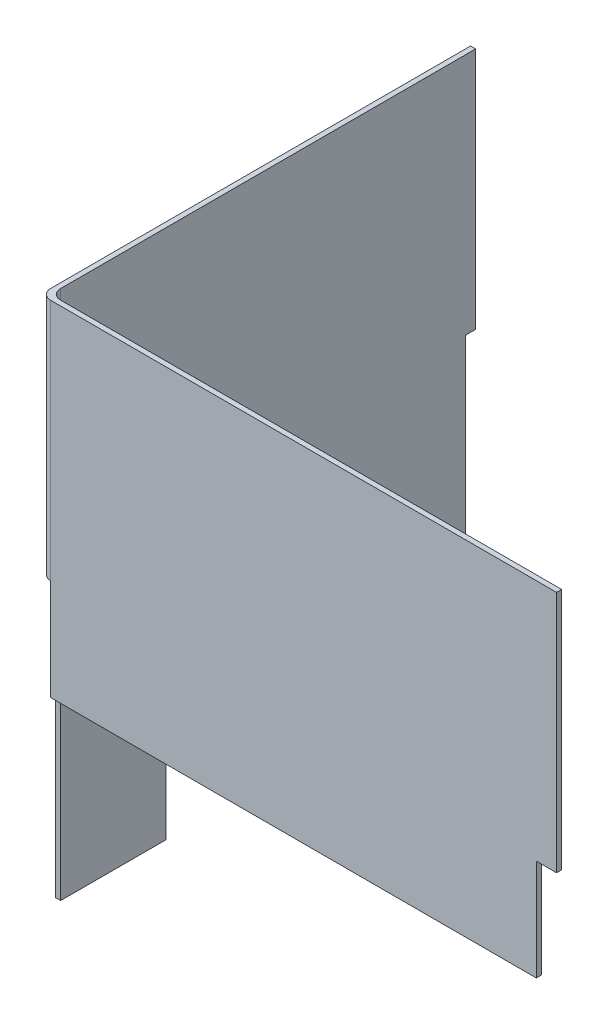
ISO-10303-21;
HEADER;
FILE_DESCRIPTION(('STEP AP214'),'2;1');
FILE_NAME('part.step','',(''),(''),'','','');
FILE_SCHEMA(('AUTOMOTIVE_DESIGN { 1 0 10303 214 1 1 1 1 }'));
ENDSEC;
DATA;
#1=APPLICATION_CONTEXT('core data for automotive mechanical design processes');
#2=APPLICATION_PROTOCOL_DEFINITION('international standard','automotive_design',2000,#1);
#3=PRODUCT_CONTEXT('',#1,'mechanical');
#4=PRODUCT('Part','Part','',(#3));
#5=PRODUCT_RELATED_PRODUCT_CATEGORY('part','',(#4));
#6=PRODUCT_DEFINITION_FORMATION('','',#4);
#7=PRODUCT_DEFINITION_CONTEXT('part definition',#1,'design');
#8=PRODUCT_DEFINITION('design','',#6,#7);
#9=PRODUCT_DEFINITION_SHAPE('','',#8);
#10=(LENGTH_UNIT() NAMED_UNIT(*) SI_UNIT(.MILLI.,.METRE.));
#11=(NAMED_UNIT(*) PLANE_ANGLE_UNIT() SI_UNIT($,.RADIAN.));
#12=(NAMED_UNIT(*) SI_UNIT($,.STERADIAN.) SOLID_ANGLE_UNIT());
#13=UNCERTAINTY_MEASURE_WITH_UNIT(LENGTH_MEASURE(1.E-05),#10,'distance_accuracy_value','');
#14=(GEOMETRIC_REPRESENTATION_CONTEXT(3) GLOBAL_UNCERTAINTY_ASSIGNED_CONTEXT((#13)) GLOBAL_UNIT_ASSIGNED_CONTEXT((#10,
#11,#12)) REPRESENTATION_CONTEXT('',''));
#15=CARTESIAN_POINT('',(0.,0.,0.));
#16=DIRECTION('',(0.,0.,1.));
#17=DIRECTION('',(1.,0.,0.));
#18=AXIS2_PLACEMENT_3D('',#15,#16,#17);
#19=CARTESIAN_POINT('',(-152.399999999999,0.,123.825));
#20=DIRECTION('',(0.,1.,0.));
#21=DIRECTION('',(0.,0.,1.));
#22=AXIS2_PLACEMENT_3D('',#19,#20,#21);
#23=PLANE('',#22);
#24=DIRECTION('',(0.,0.,-1.));
#25=VECTOR('',#24,1.);
#26=CARTESIAN_POINT('',(-155.575,0.,-139.7));
#27=LINE('',#26,#25);
#28=CARTESIAN_POINT('',(-155.575,0.,-133.349999999999));
#29=VERTEX_POINT('',#28);
#30=CARTESIAN_POINT('',(-155.575,0.,-139.7));
#31=VERTEX_POINT('',#30);
#32=EDGE_CURVE('E148',#29,#31,#27,.T.);
#33=ORIENTED_EDGE('',*,*,#32,.F.);
#34=DIRECTION('',(-1.,0.,0.));
#35=VECTOR('',#34,1.);
#36=CARTESIAN_POINT('',(-155.575,0.,-133.349999999999));
#37=LINE('',#36,#35);
#38=CARTESIAN_POINT('',(-158.75,0.,-133.349999999999));
#39=VERTEX_POINT('',#38);
#40=EDGE_CURVE('E222',#29,#39,#37,.T.);
#41=ORIENTED_EDGE('',*,*,#40,.T.);
#42=DIRECTION('',(0.,0.,1.));
#43=VECTOR('',#42,1.);
#44=CARTESIAN_POINT('',(-158.75,0.,-139.7));
#45=LINE('',#44,#43);
#46=CARTESIAN_POINT('',(-158.75,0.,-139.7));
#47=VERTEX_POINT('',#46);
#48=EDGE_CURVE('E152',#47,#39,#45,.T.);
#49=ORIENTED_EDGE('',*,*,#48,.F.);
#50=DIRECTION('',(-1.,0.,0.));
#51=VECTOR('',#50,1.);
#52=CARTESIAN_POINT('',(-158.75,0.,-139.7));
#53=LINE('',#52,#51);
#54=EDGE_CURVE('E150',#31,#47,#53,.T.);
#55=ORIENTED_EDGE('',*,*,#54,.F.);
#56=EDGE_LOOP('',(#33,#41,#49,#55));
#57=FACE_BOUND('',#56,.T.);
#58=ADVANCED_FACE('F33',(#57),#23,.F.);
#59=DIRECTION('',(0.,0.,1.));
#60=VECTOR('',#59,1.);
#61=CARTESIAN_POINT('',(152.399999999993,0.,127.));
#62=LINE('',#61,#60);
#63=CARTESIAN_POINT('',(152.399999999993,0.,127.));
#64=VERTEX_POINT('',#63);
#65=CARTESIAN_POINT('',(152.399999999993,0.,130.175));
#66=VERTEX_POINT('',#65);
#67=EDGE_CURVE('E183',#64,#66,#62,.T.);
#68=ORIENTED_EDGE('',*,*,#67,.F.);
#69=DIRECTION('',(-1.,0.,0.));
#70=VECTOR('',#69,1.);
#71=CARTESIAN_POINT('',(-149.224999999999,0.,127.));
#72=LINE('',#71,#70);
#73=CARTESIAN_POINT('',(165.099999999993,0.,127.));
#74=VERTEX_POINT('',#73);
#75=EDGE_CURVE('E141',#74,#64,#72,.T.);
#76=ORIENTED_EDGE('',*,*,#75,.F.);
#77=DIRECTION('',(0.,0.,-1.));
#78=VECTOR('',#77,1.);
#79=CARTESIAN_POINT('',(165.099999999993,0.,127.));
#80=LINE('',#79,#78);
#81=CARTESIAN_POINT('',(165.099999999993,0.,130.175));
#82=VERTEX_POINT('',#81);
#83=EDGE_CURVE('E138',#82,#74,#80,.T.);
#84=ORIENTED_EDGE('',*,*,#83,.F.);
#85=DIRECTION('',(1.,0.,0.));
#86=VECTOR('',#85,1.);
#87=CARTESIAN_POINT('',(-152.399999999999,0.,130.175));
#88=LINE('',#87,#86);
#89=EDGE_CURVE('E84',#66,#82,#88,.T.);
#90=ORIENTED_EDGE('',*,*,#89,.F.);
#91=EDGE_LOOP('',(#68,#76,#84,#90));
#92=FACE_BOUND('',#91,.T.);
#93=ADVANCED_FACE('F180',(#92),#23,.F.);
#94=CARTESIAN_POINT('',(165.099999999993,152.4,127.));
#95=DIRECTION('',(-1.,0.,0.));
#96=DIRECTION('',(0.,0.,1.));
#97=AXIS2_PLACEMENT_3D('',#94,#95,#96);
#98=PLANE('',#97);
#99=ORIENTED_EDGE('',*,*,#83,.T.);
#100=DIRECTION('',(0.,-1.,0.));
#101=VECTOR('',#100,1.);
#102=CARTESIAN_POINT('',(165.099999999993,152.4,127.));
#103=LINE('',#102,#101);
#104=CARTESIAN_POINT('',(165.099999999993,152.4,127.));
#105=VERTEX_POINT('',#104);
#106=EDGE_CURVE('E37',#105,#74,#103,.T.);
#107=ORIENTED_EDGE('',*,*,#106,.F.);
#108=DIRECTION('',(0.,0.,-1.));
#109=VECTOR('',#108,1.);
#110=CARTESIAN_POINT('',(165.099999999993,152.4,127.));
#111=LINE('',#110,#109);
#112=CARTESIAN_POINT('',(165.099999999993,152.4,130.175));
#113=VERTEX_POINT('',#112);
#114=EDGE_CURVE('E157',#113,#105,#111,.T.);
#115=ORIENTED_EDGE('',*,*,#114,.F.);
#116=DIRECTION('',(0.,-1.,0.));
#117=VECTOR('',#116,1.);
#118=CARTESIAN_POINT('',(165.099999999993,152.4,130.175));
#119=LINE('',#118,#117);
#120=EDGE_CURVE('E134',#113,#82,#119,.T.);
#121=ORIENTED_EDGE('',*,*,#120,.T.);
#122=EDGE_LOOP('',(#99,#107,#115,#121));
#123=FACE_BOUND('',#122,.T.);
#124=ADVANCED_FACE('F35',(#123),#98,.F.);
#125=CARTESIAN_POINT('',(-149.224999999999,152.4,127.));
#126=DIRECTION('',(0.,0.,1.));
#127=DIRECTION('',(1.,0.,0.));
#128=AXIS2_PLACEMENT_3D('',#125,#126,#127);
#129=PLANE('',#128);
#130=ORIENTED_EDGE('',*,*,#75,.T.);
#131=DIRECTION('',(0.,1.,0.));
#132=VECTOR('',#131,1.);
#133=CARTESIAN_POINT('',(152.399999999993,-63.5,127.));
#134=LINE('',#133,#132);
#135=CARTESIAN_POINT('',(152.399999999993,-63.5,127.));
#136=VERTEX_POINT('',#135);
#137=EDGE_CURVE('E249',#136,#64,#134,.T.);
#138=ORIENTED_EDGE('',*,*,#137,.F.);
#139=DIRECTION('',(1.,0.,0.));
#140=VECTOR('',#139,1.);
#141=CARTESIAN_POINT('',(-152.400000000007,-63.5,127.));
#142=LINE('',#141,#140);
#143=CARTESIAN_POINT('',(-152.400000000007,-63.5,127.));
#144=VERTEX_POINT('',#143);
#145=EDGE_CURVE('E191',#144,#136,#142,.T.);
#146=ORIENTED_EDGE('',*,*,#145,.F.);
#147=DIRECTION('',(0.,-1.,0.));
#148=VECTOR('',#147,1.);
#149=CARTESIAN_POINT('',(-152.400000000007,-63.5,127.));
#150=LINE('',#149,#148);
#151=CARTESIAN_POINT('',(-152.400000000007,0.,127.));
#152=VERTEX_POINT('',#151);
#153=EDGE_CURVE('E197',#152,#144,#150,.T.);
#154=ORIENTED_EDGE('',*,*,#153,.F.);
#155=DIRECTION('',(-1.,0.,0.));
#156=VECTOR('',#155,1.);
#157=CARTESIAN_POINT('',(-152.400000000007,0.,127.));
#158=LINE('',#157,#156);
#159=CARTESIAN_POINT('',(-149.224999999999,0.,127.));
#160=VERTEX_POINT('',#159);
#161=EDGE_CURVE('E11',#160,#152,#158,.T.);
#162=ORIENTED_EDGE('',*,*,#161,.F.);
#163=DIRECTION('',(0.,-1.,0.));
#164=VECTOR('',#163,1.);
#165=CARTESIAN_POINT('',(-149.224999999999,152.4,127.));
#166=LINE('',#165,#164);
#167=CARTESIAN_POINT('',(-149.224999999999,152.4,127.));
#168=VERTEX_POINT('',#167);
#169=EDGE_CURVE('E166',#168,#160,#166,.T.);
#170=ORIENTED_EDGE('',*,*,#169,.F.);
#171=DIRECTION('',(-1.,0.,0.));
#172=VECTOR('',#171,1.);
#173=CARTESIAN_POINT('',(-149.224999999999,152.4,127.));
#174=LINE('',#173,#172);
#175=EDGE_CURVE('E93',#105,#168,#174,.T.);
#176=ORIENTED_EDGE('',*,*,#175,.F.);
#177=ORIENTED_EDGE('',*,*,#106,.T.);
#178=EDGE_LOOP('',(#130,#138,#146,#154,#162,#170,#176,#177));
#179=FACE_BOUND('',#178,.T.);
#180=ADVANCED_FACE('F172',(#179),#129,.F.);
#181=CARTESIAN_POINT('',(-149.224999999999,152.4,120.65));
#182=DIRECTION('',(0.,-1.,0.));
#183=DIRECTION('',(0.,0.,-1.));
#184=AXIS2_PLACEMENT_3D('',#181,#182,#183);
#185=CYLINDRICAL_SURFACE('',#184,6.35000000000001);
#186=CARTESIAN_POINT('',(-149.224999999999,0.,120.65));
#187=DIRECTION('',(0.,-1.,0.));
#188=DIRECTION('',(0.,0.,-1.));
#189=AXIS2_PLACEMENT_3D('',#186,#187,#188);
#190=CIRCLE('',#189,6.35000000000001);
#191=CARTESIAN_POINT('',(-155.574999999999,0.,120.650000000001));
#192=VERTEX_POINT('',#191);
#193=EDGE_CURVE('E145',#160,#192,#190,.T.);
#194=ORIENTED_EDGE('',*,*,#193,.T.);
#195=DIRECTION('',(0.,-1.,0.));
#196=VECTOR('',#195,1.);
#197=CARTESIAN_POINT('',(-155.574999999999,152.4,120.65));
#198=LINE('',#197,#196);
#199=CARTESIAN_POINT('',(-155.574999999999,152.4,120.65));
#200=VERTEX_POINT('',#199);
#201=EDGE_CURVE('E164',#200,#192,#198,.T.);
#202=ORIENTED_EDGE('',*,*,#201,.F.);
#203=CARTESIAN_POINT('',(-149.224999999999,152.4,120.65));
#204=DIRECTION('',(0.,-1.,0.));
#205=DIRECTION('',(0.,0.,-1.));
#206=AXIS2_PLACEMENT_3D('',#203,#204,#205);
#207=CIRCLE('',#206,6.35000000000001);
#208=EDGE_CURVE('E203',#168,#200,#207,.T.);
#209=ORIENTED_EDGE('',*,*,#208,.F.);
#210=ORIENTED_EDGE('',*,*,#169,.T.);
#211=EDGE_LOOP('',(#194,#202,#209,#210));
#212=FACE_BOUND('',#211,.T.);
#213=ADVANCED_FACE('F381',(#212),#185,.F.);
#214=CARTESIAN_POINT('',(-155.575,152.4,-139.7));
#215=DIRECTION('',(-1.,0.,0.));
#216=DIRECTION('',(0.,0.,1.));
#217=AXIS2_PLACEMENT_3D('',#214,#215,#216);
#218=PLANE('',#217);
#219=ORIENTED_EDGE('',*,*,#201,.T.);
#220=DIRECTION('',(0.,1.,0.));
#221=VECTOR('',#220,1.);
#222=CARTESIAN_POINT('',(-155.574999999999,0.,120.650000000001));
#223=LINE('',#222,#221);
#224=CARTESIAN_POINT('',(-155.574999999999,-180.1876,120.650000000001));
#225=VERTEX_POINT('',#224);
#226=EDGE_CURVE('E347',#225,#192,#223,.T.);
#227=ORIENTED_EDGE('',*,*,#226,.F.);
#228=DIRECTION('',(0.,0.,1.));
#229=VECTOR('',#228,1.);
#230=CARTESIAN_POINT('',(-155.574999999999,-180.1876,120.650000000001));
#231=LINE('',#230,#229);
#232=CARTESIAN_POINT('',(-155.574999999999,-180.1876,54.6100000000006));
#233=VERTEX_POINT('',#232);
#234=EDGE_CURVE('E337',#233,#225,#231,.T.);
#235=ORIENTED_EDGE('',*,*,#234,.F.);
#236=DIRECTION('',(0.,-1.,0.));
#237=VECTOR('',#236,1.);
#238=CARTESIAN_POINT('',(-155.574999999999,-139.7,54.6100000000006));
#239=LINE('',#238,#237);
#240=CARTESIAN_POINT('',(-155.574999999999,-139.7,54.6100000000006));
#241=VERTEX_POINT('',#240);
#242=EDGE_CURVE('E323',#241,#233,#239,.T.);
#243=ORIENTED_EDGE('',*,*,#242,.F.);
#244=CARTESIAN_POINT('',(-155.575,-139.7,-6.34999999999943));
#245=DIRECTION('',(1.,0.,0.));
#246=DIRECTION('',(0.,0.,1.));
#247=AXIS2_PLACEMENT_3D('',#244,#245,#246);
#248=CIRCLE('',#247,60.96);
#249=CARTESIAN_POINT('',(-155.575,-139.7,-67.3099999999994));
#250=VERTEX_POINT('',#249);
#251=EDGE_CURVE('E333',#250,#241,#248,.T.);
#252=ORIENTED_EDGE('',*,*,#251,.F.);
#253=DIRECTION('',(0.,1.,0.));
#254=VECTOR('',#253,1.);
#255=CARTESIAN_POINT('',(-155.575,-139.7,-67.3099999999994));
#256=LINE('',#255,#254);
#257=CARTESIAN_POINT('',(-155.575,-180.1876,-67.3099999999994));
#258=VERTEX_POINT('',#257);
#259=EDGE_CURVE('E248',#258,#250,#256,.T.);
#260=ORIENTED_EDGE('',*,*,#259,.F.);
#261=DIRECTION('',(0.,0.,1.));
#262=VECTOR('',#261,1.);
#263=CARTESIAN_POINT('',(-155.575,-180.1876,-67.3099999999994));
#264=LINE('',#263,#262);
#265=CARTESIAN_POINT('',(-155.575,-180.1876,-133.349999999998));
#266=VERTEX_POINT('',#265);
#267=EDGE_CURVE('E351',#266,#258,#264,.T.);
#268=ORIENTED_EDGE('',*,*,#267,.F.);
#269=DIRECTION('',(0.,-1.,0.));
#270=VECTOR('',#269,1.);
#271=CARTESIAN_POINT('',(-155.575,-180.1876,-133.349999999998));
#272=LINE('',#271,#270);
#273=EDGE_CURVE('E349',#29,#266,#272,.T.);
#274=ORIENTED_EDGE('',*,*,#273,.F.);
#275=ORIENTED_EDGE('',*,*,#32,.T.);
#276=DIRECTION('',(0.,-1.,0.));
#277=VECTOR('',#276,1.);
#278=CARTESIAN_POINT('',(-155.575,152.4,-139.7));
#279=LINE('',#278,#277);
#280=CARTESIAN_POINT('',(-155.575,152.4,-139.7));
#281=VERTEX_POINT('',#280);
#282=EDGE_CURVE('E161',#281,#31,#279,.T.);
#283=ORIENTED_EDGE('',*,*,#282,.F.);
#284=DIRECTION('',(0.,0.,-1.));
#285=VECTOR('',#284,1.);
#286=CARTESIAN_POINT('',(-155.575,152.4,-139.7));
#287=LINE('',#286,#285);
#288=EDGE_CURVE('E205',#200,#281,#287,.T.);
#289=ORIENTED_EDGE('',*,*,#288,.F.);
#290=EDGE_LOOP('',(#219,#227,#235,#243,#252,#260,#268,#274,#275,#283,#289));
#291=FACE_BOUND('',#290,.T.);
#292=ADVANCED_FACE('F210',(#291),#218,.F.);
#293=CARTESIAN_POINT('',(-158.75,152.4,-139.7));
#294=DIRECTION('',(0.,0.,1.));
#295=DIRECTION('',(1.,0.,0.));
#296=AXIS2_PLACEMENT_3D('',#293,#294,#295);
#297=PLANE('',#296);
#298=ORIENTED_EDGE('',*,*,#54,.T.);
#299=DIRECTION('',(0.,-1.,0.));
#300=VECTOR('',#299,1.);
#301=CARTESIAN_POINT('',(-158.75,152.4,-139.7));
#302=LINE('',#301,#300);
#303=CARTESIAN_POINT('',(-158.75,152.4,-139.7));
#304=VERTEX_POINT('',#303);
#305=EDGE_CURVE('E128',#304,#47,#302,.T.);
#306=ORIENTED_EDGE('',*,*,#305,.F.);
#307=DIRECTION('',(-1.,0.,0.));
#308=VECTOR('',#307,1.);
#309=CARTESIAN_POINT('',(-158.75,152.4,-139.7));
#310=LINE('',#309,#308);
#311=EDGE_CURVE('E115',#281,#304,#310,.T.);
#312=ORIENTED_EDGE('',*,*,#311,.F.);
#313=ORIENTED_EDGE('',*,*,#282,.T.);
#314=EDGE_LOOP('',(#298,#306,#312,#313));
#315=FACE_BOUND('',#314,.T.);
#316=ADVANCED_FACE('F215',(#315),#297,.F.);
#317=CARTESIAN_POINT('',(-158.75,152.4,-139.7));
#318=DIRECTION('',(1.,0.,0.));
#319=DIRECTION('',(0.,0.,-1.));
#320=AXIS2_PLACEMENT_3D('',#317,#318,#319);
#321=PLANE('',#320);
#322=ORIENTED_EDGE('',*,*,#48,.T.);
#323=DIRECTION('',(0.,-1.,0.));
#324=VECTOR('',#323,1.);
#325=CARTESIAN_POINT('',(-158.75,-180.1876,-133.349999999998));
#326=LINE('',#325,#324);
#327=CARTESIAN_POINT('',(-158.75,-180.1876,-133.349999999998));
#328=VERTEX_POINT('',#327);
#329=EDGE_CURVE('E361',#39,#328,#326,.T.);
#330=ORIENTED_EDGE('',*,*,#329,.T.);
#331=DIRECTION('',(0.,0.,1.));
#332=VECTOR('',#331,1.);
#333=CARTESIAN_POINT('',(-158.75,-180.1876,-67.3099999999994));
#334=LINE('',#333,#332);
#335=CARTESIAN_POINT('',(-158.75,-180.1876,-67.3099999999994));
#336=VERTEX_POINT('',#335);
#337=EDGE_CURVE('E343',#328,#336,#334,.T.);
#338=ORIENTED_EDGE('',*,*,#337,.T.);
#339=DIRECTION('',(0.,1.,0.));
#340=VECTOR('',#339,1.);
#341=CARTESIAN_POINT('',(-158.75,-139.7,-67.3099999999994));
#342=LINE('',#341,#340);
#343=CARTESIAN_POINT('',(-158.75,-139.7,-67.3099999999994));
#344=VERTEX_POINT('',#343);
#345=EDGE_CURVE('E340',#336,#344,#342,.T.);
#346=ORIENTED_EDGE('',*,*,#345,.T.);
#347=CARTESIAN_POINT('',(-158.75,-139.7,-6.34999999999942));
#348=DIRECTION('',(1.,0.,0.));
#349=DIRECTION('',(0.,0.,1.));
#350=AXIS2_PLACEMENT_3D('',#347,#348,#349);
#351=CIRCLE('',#350,60.96);
#352=CARTESIAN_POINT('',(-158.749999999999,-139.7,54.6100000000006));
#353=VERTEX_POINT('',#352);
#354=EDGE_CURVE('E355',#344,#353,#351,.T.);
#355=ORIENTED_EDGE('',*,*,#354,.T.);
#356=DIRECTION('',(0.,-1.,0.));
#357=VECTOR('',#356,1.);
#358=CARTESIAN_POINT('',(-158.749999999999,-139.7,54.6100000000006));
#359=LINE('',#358,#357);
#360=CARTESIAN_POINT('',(-158.749999999999,-180.1876,54.6100000000006));
#361=VERTEX_POINT('',#360);
#362=EDGE_CURVE('E325',#353,#361,#359,.T.);
#363=ORIENTED_EDGE('',*,*,#362,.T.);
#364=DIRECTION('',(0.,0.,1.));
#365=VECTOR('',#364,1.);
#366=CARTESIAN_POINT('',(-158.749999999999,-180.1876,120.650000000001));
#367=LINE('',#366,#365);
#368=CARTESIAN_POINT('',(-158.749999999999,-180.1876,120.650000000001));
#369=VERTEX_POINT('',#368);
#370=EDGE_CURVE('E358',#361,#369,#367,.T.);
#371=ORIENTED_EDGE('',*,*,#370,.T.);
#372=DIRECTION('',(0.,1.,0.));
#373=VECTOR('',#372,1.);
#374=CARTESIAN_POINT('',(-158.749999999999,0.,120.650000000001));
#375=LINE('',#374,#373);
#376=CARTESIAN_POINT('',(-158.749999999999,0.,120.650000000001));
#377=VERTEX_POINT('',#376);
#378=EDGE_CURVE('E49',#369,#377,#375,.T.);
#379=ORIENTED_EDGE('',*,*,#378,.T.);
#380=CARTESIAN_POINT('',(-158.749999999999,0.,123.825));
#381=VERTEX_POINT('',#380);
#382=EDGE_CURVE('E124',#377,#381,#45,.T.);
#383=ORIENTED_EDGE('',*,*,#382,.T.);
#384=DIRECTION('',(0.,-1.,0.));
#385=VECTOR('',#384,1.);
#386=CARTESIAN_POINT('',(-158.749999999999,152.4,123.825));
#387=LINE('',#386,#385);
#388=CARTESIAN_POINT('',(-158.749999999999,152.4,123.825));
#389=VERTEX_POINT('',#388);
#390=EDGE_CURVE('E120',#389,#381,#387,.T.);
#391=ORIENTED_EDGE('',*,*,#390,.F.);
#392=DIRECTION('',(0.,0.,1.));
#393=VECTOR('',#392,1.);
#394=CARTESIAN_POINT('',(-158.75,152.4,-139.7));
#395=LINE('',#394,#393);
#396=EDGE_CURVE('E108',#304,#389,#395,.T.);
#397=ORIENTED_EDGE('',*,*,#396,.F.);
#398=ORIENTED_EDGE('',*,*,#305,.T.);
#399=EDGE_LOOP('',(#322,#330,#338,#346,#355,#363,#371,#379,#383,#391,#397,#398));
#400=FACE_BOUND('',#399,.T.);
#401=ADVANCED_FACE('F122',(#400),#321,.F.);
#402=CARTESIAN_POINT('',(-152.399999999999,152.4,123.825));
#403=DIRECTION('',(0.,-1.,0.));
#404=DIRECTION('',(0.,0.,-1.));
#405=AXIS2_PLACEMENT_3D('',#402,#403,#404);
#406=CYLINDRICAL_SURFACE('',#405,6.35000000000001);
#407=CARTESIAN_POINT('',(-152.399999999999,0.,123.825));
#408=DIRECTION('',(0.,1.,0.));
#409=DIRECTION('',(0.,0.,1.));
#410=AXIS2_PLACEMENT_3D('',#407,#408,#409);
#411=CIRCLE('',#410,6.35000000000001);
#412=CARTESIAN_POINT('',(-152.399999999999,0.,130.175));
#413=VERTEX_POINT('',#412);
#414=EDGE_CURVE('E154',#381,#413,#411,.T.);
#415=ORIENTED_EDGE('',*,*,#414,.T.);
#416=DIRECTION('',(0.,-1.,0.));
#417=VECTOR('',#416,1.);
#418=CARTESIAN_POINT('',(-152.399999999999,152.4,130.175));
#419=LINE('',#418,#417);
#420=CARTESIAN_POINT('',(-152.399999999999,152.4,130.175));
#421=VERTEX_POINT('',#420);
#422=EDGE_CURVE('E129',#421,#413,#419,.T.);
#423=ORIENTED_EDGE('',*,*,#422,.F.);
#424=CARTESIAN_POINT('',(-152.399999999999,152.4,123.825));
#425=DIRECTION('',(0.,1.,0.));
#426=DIRECTION('',(0.,0.,1.));
#427=AXIS2_PLACEMENT_3D('',#424,#425,#426);
#428=CIRCLE('',#427,6.35000000000001);
#429=EDGE_CURVE('E112',#389,#421,#428,.T.);
#430=ORIENTED_EDGE('',*,*,#429,.F.);
#431=ORIENTED_EDGE('',*,*,#390,.T.);
#432=EDGE_LOOP('',(#415,#423,#430,#431));
#433=FACE_BOUND('',#432,.T.);
#434=ADVANCED_FACE('F131',(#433),#406,.T.);
#435=CARTESIAN_POINT('',(-152.399999999999,152.4,130.175));
#436=DIRECTION('',(0.,0.,-1.));
#437=DIRECTION('',(-1.,0.,0.));
#438=AXIS2_PLACEMENT_3D('',#435,#436,#437);
#439=PLANE('',#438);
#440=ORIENTED_EDGE('',*,*,#422,.T.);
#441=DIRECTION('',(0.,-1.,0.));
#442=VECTOR('',#441,1.);
#443=CARTESIAN_POINT('',(-152.400000000007,-63.5,130.175));
#444=LINE('',#443,#442);
#445=CARTESIAN_POINT('',(-152.400000000007,-63.5,130.175));
#446=VERTEX_POINT('',#445);
#447=EDGE_CURVE('E256',#413,#446,#444,.T.);
#448=ORIENTED_EDGE('',*,*,#447,.T.);
#449=DIRECTION('',(1.,0.,0.));
#450=VECTOR('',#449,1.);
#451=CARTESIAN_POINT('',(-152.400000000007,-63.5,130.175));
#452=LINE('',#451,#450);
#453=CARTESIAN_POINT('',(152.399999999993,-63.5,130.175));
#454=VERTEX_POINT('',#453);
#455=EDGE_CURVE('E250',#446,#454,#452,.T.);
#456=ORIENTED_EDGE('',*,*,#455,.T.);
#457=DIRECTION('',(0.,1.,0.));
#458=VECTOR('',#457,1.);
#459=CARTESIAN_POINT('',(152.399999999993,-63.5,130.175));
#460=LINE('',#459,#458);
#461=EDGE_CURVE('E254',#454,#66,#460,.T.);
#462=ORIENTED_EDGE('',*,*,#461,.T.);
#463=ORIENTED_EDGE('',*,*,#89,.T.);
#464=ORIENTED_EDGE('',*,*,#120,.F.);
#465=DIRECTION('',(1.,0.,0.));
#466=VECTOR('',#465,1.);
#467=CARTESIAN_POINT('',(-152.399999999999,152.4,130.175));
#468=LINE('',#467,#466);
#469=EDGE_CURVE('E58',#421,#113,#468,.T.);
#470=ORIENTED_EDGE('',*,*,#469,.F.);
#471=EDGE_LOOP('',(#440,#448,#456,#462,#463,#464,#470));
#472=FACE_BOUND('',#471,.T.);
#473=ADVANCED_FACE('F275',(#472),#439,.F.);
#474=CARTESIAN_POINT('',(-152.399999999999,152.4,123.825));
#475=DIRECTION('',(0.,1.,0.));
#476=DIRECTION('',(0.,0.,1.));
#477=AXIS2_PLACEMENT_3D('',#474,#475,#476);
#478=PLANE('',#477);
#479=ORIENTED_EDGE('',*,*,#114,.T.);
#480=ORIENTED_EDGE('',*,*,#175,.T.);
#481=ORIENTED_EDGE('',*,*,#208,.T.);
#482=ORIENTED_EDGE('',*,*,#288,.T.);
#483=ORIENTED_EDGE('',*,*,#311,.T.);
#484=ORIENTED_EDGE('',*,*,#396,.T.);
#485=ORIENTED_EDGE('',*,*,#429,.T.);
#486=ORIENTED_EDGE('',*,*,#469,.T.);
#487=EDGE_LOOP('',(#479,#480,#481,#482,#483,#484,#485,#486));
#488=FACE_BOUND('',#487,.T.);
#489=ADVANCED_FACE('F110',(#488),#478,.T.);
#490=ORIENTED_EDGE('',*,*,#382,.F.);
#491=DIRECTION('',(-1.,0.,0.));
#492=VECTOR('',#491,1.);
#493=CARTESIAN_POINT('',(-155.574999999999,0.,120.650000000001));
#494=LINE('',#493,#492);
#495=EDGE_CURVE('E231',#192,#377,#494,.T.);
#496=ORIENTED_EDGE('',*,*,#495,.F.);
#497=ORIENTED_EDGE('',*,*,#193,.F.);
#498=ORIENTED_EDGE('',*,*,#161,.T.);
#499=DIRECTION('',(0.,0.,1.));
#500=VECTOR('',#499,1.);
#501=CARTESIAN_POINT('',(-152.400000000007,0.,127.));
#502=LINE('',#501,#500);
#503=EDGE_CURVE('E190',#152,#413,#502,.T.);
#504=ORIENTED_EDGE('',*,*,#503,.T.);
#505=ORIENTED_EDGE('',*,*,#414,.F.);
#506=EDGE_LOOP('',(#490,#496,#497,#498,#504,#505));
#507=FACE_BOUND('',#506,.T.);
#508=ADVANCED_FACE('F379',(#507),#23,.F.);
#509=CARTESIAN_POINT('',(152.399999999993,-63.5,127.));
#510=DIRECTION('',(1.,0.,0.));
#511=DIRECTION('',(0.,0.,-1.));
#512=AXIS2_PLACEMENT_3D('',#509,#510,#511);
#513=PLANE('',#512);
#514=ORIENTED_EDGE('',*,*,#461,.F.);
#515=DIRECTION('',(0.,0.,1.));
#516=VECTOR('',#515,1.);
#517=CARTESIAN_POINT('',(152.399999999993,-63.5,127.));
#518=LINE('',#517,#516);
#519=EDGE_CURVE('E142',#136,#454,#518,.T.);
#520=ORIENTED_EDGE('',*,*,#519,.F.);
#521=ORIENTED_EDGE('',*,*,#137,.T.);
#522=ORIENTED_EDGE('',*,*,#67,.T.);
#523=EDGE_LOOP('',(#514,#520,#521,#522));
#524=FACE_BOUND('',#523,.T.);
#525=ADVANCED_FACE('F279',(#524),#513,.T.);
#526=CARTESIAN_POINT('',(-152.400000000007,-63.5,127.));
#527=DIRECTION('',(0.,-1.,0.));
#528=DIRECTION('',(0.,0.,-1.));
#529=AXIS2_PLACEMENT_3D('',#526,#527,#528);
#530=PLANE('',#529);
#531=ORIENTED_EDGE('',*,*,#455,.F.);
#532=DIRECTION('',(0.,0.,1.));
#533=VECTOR('',#532,1.);
#534=CARTESIAN_POINT('',(-152.400000000007,-63.5,127.));
#535=LINE('',#534,#533);
#536=EDGE_CURVE('E194',#144,#446,#535,.T.);
#537=ORIENTED_EDGE('',*,*,#536,.F.);
#538=ORIENTED_EDGE('',*,*,#145,.T.);
#539=ORIENTED_EDGE('',*,*,#519,.T.);
#540=EDGE_LOOP('',(#531,#537,#538,#539));
#541=FACE_BOUND('',#540,.T.);
#542=ADVANCED_FACE('F276',(#541),#530,.T.);
#543=CARTESIAN_POINT('',(-152.400000000007,-63.5,127.));
#544=DIRECTION('',(-1.,0.,0.));
#545=DIRECTION('',(0.,0.,1.));
#546=AXIS2_PLACEMENT_3D('',#543,#544,#545);
#547=PLANE('',#546);
#548=ORIENTED_EDGE('',*,*,#447,.F.);
#549=ORIENTED_EDGE('',*,*,#503,.F.);
#550=ORIENTED_EDGE('',*,*,#153,.T.);
#551=ORIENTED_EDGE('',*,*,#536,.T.);
#552=EDGE_LOOP('',(#548,#549,#550,#551));
#553=FACE_BOUND('',#552,.T.);
#554=ADVANCED_FACE('F267',(#553),#547,.T.);
#555=CARTESIAN_POINT('',(-155.575,-139.7,-6.34999999999943));
#556=DIRECTION('',(-1.,0.,0.));
#557=DIRECTION('',(0.,0.,1.));
#558=AXIS2_PLACEMENT_3D('',#555,#556,#557);
#559=CYLINDRICAL_SURFACE('',#558,60.96);
#560=ORIENTED_EDGE('',*,*,#354,.F.);
#561=DIRECTION('',(-1.,0.,0.));
#562=VECTOR('',#561,1.);
#563=CARTESIAN_POINT('',(-155.575,-139.7,-67.3099999999994));
#564=LINE('',#563,#562);
#565=EDGE_CURVE('E257',#250,#344,#564,.T.);
#566=ORIENTED_EDGE('',*,*,#565,.F.);
#567=ORIENTED_EDGE('',*,*,#251,.T.);
#568=DIRECTION('',(-1.,0.,0.));
#569=VECTOR('',#568,1.);
#570=CARTESIAN_POINT('',(-155.574999999999,-139.7,54.6100000000006));
#571=LINE('',#570,#569);
#572=EDGE_CURVE('E245',#241,#353,#571,.T.);
#573=ORIENTED_EDGE('',*,*,#572,.T.);
#574=EDGE_LOOP('',(#560,#566,#567,#573));
#575=FACE_BOUND('',#574,.T.);
#576=ADVANCED_FACE('F339',(#575),#559,.F.);
#577=CARTESIAN_POINT('',(-155.575,-139.7,-67.3099999999994));
#578=DIRECTION('',(0.,0.,1.));
#579=DIRECTION('',(1.,0.,0.));
#580=AXIS2_PLACEMENT_3D('',#577,#578,#579);
#581=PLANE('',#580);
#582=ORIENTED_EDGE('',*,*,#345,.F.);
#583=DIRECTION('',(-1.,0.,0.));
#584=VECTOR('',#583,1.);
#585=CARTESIAN_POINT('',(-155.575,-180.1876,-67.3099999999994));
#586=LINE('',#585,#584);
#587=EDGE_CURVE('E234',#258,#336,#586,.T.);
#588=ORIENTED_EDGE('',*,*,#587,.F.);
#589=ORIENTED_EDGE('',*,*,#259,.T.);
#590=ORIENTED_EDGE('',*,*,#565,.T.);
#591=EDGE_LOOP('',(#582,#588,#589,#590));
#592=FACE_BOUND('',#591,.T.);
#593=ADVANCED_FACE('F371',(#592),#581,.T.);
#594=CARTESIAN_POINT('',(-155.575,-180.1876,-67.3099999999994));
#595=DIRECTION('',(0.,-1.,0.));
#596=DIRECTION('',(0.,0.,-1.));
#597=AXIS2_PLACEMENT_3D('',#594,#595,#596);
#598=PLANE('',#597);
#599=ORIENTED_EDGE('',*,*,#337,.F.);
#600=DIRECTION('',(-1.,0.,0.));
#601=VECTOR('',#600,1.);
#602=CARTESIAN_POINT('',(-155.575,-180.1876,-133.349999999998));
#603=LINE('',#602,#601);
#604=EDGE_CURVE('E230',#266,#328,#603,.T.);
#605=ORIENTED_EDGE('',*,*,#604,.F.);
#606=ORIENTED_EDGE('',*,*,#267,.T.);
#607=ORIENTED_EDGE('',*,*,#587,.T.);
#608=EDGE_LOOP('',(#599,#605,#606,#607));
#609=FACE_BOUND('',#608,.T.);
#610=ADVANCED_FACE('F367',(#609),#598,.T.);
#611=CARTESIAN_POINT('',(-155.575,-180.1876,-133.349999999998));
#612=DIRECTION('',(0.,0.,-1.));
#613=DIRECTION('',(0.,1.,0.));
#614=AXIS2_PLACEMENT_3D('',#611,#612,#613);
#615=PLANE('',#614);
#616=ORIENTED_EDGE('',*,*,#329,.F.);
#617=ORIENTED_EDGE('',*,*,#40,.F.);
#618=ORIENTED_EDGE('',*,*,#273,.T.);
#619=ORIENTED_EDGE('',*,*,#604,.T.);
#620=EDGE_LOOP('',(#616,#617,#618,#619));
#621=FACE_BOUND('',#620,.T.);
#622=ADVANCED_FACE('F418',(#621),#615,.T.);
#623=CARTESIAN_POINT('',(-155.574999999999,0.,120.650000000001));
#624=DIRECTION('',(0.,0.,1.));
#625=DIRECTION('',(1.,0.,0.));
#626=AXIS2_PLACEMENT_3D('',#623,#624,#625);
#627=PLANE('',#626);
#628=ORIENTED_EDGE('',*,*,#378,.F.);
#629=DIRECTION('',(-1.,0.,0.));
#630=VECTOR('',#629,1.);
#631=CARTESIAN_POINT('',(-155.574999999999,-180.1876,120.650000000001));
#632=LINE('',#631,#630);
#633=EDGE_CURVE('E236',#225,#369,#632,.T.);
#634=ORIENTED_EDGE('',*,*,#633,.F.);
#635=ORIENTED_EDGE('',*,*,#226,.T.);
#636=ORIENTED_EDGE('',*,*,#495,.T.);
#637=EDGE_LOOP('',(#628,#634,#635,#636));
#638=FACE_BOUND('',#637,.T.);
#639=ADVANCED_FACE('F376',(#638),#627,.T.);
#640=CARTESIAN_POINT('',(-155.574999999999,-180.1876,120.650000000001));
#641=DIRECTION('',(0.,-1.,0.));
#642=DIRECTION('',(0.,0.,-1.));
#643=AXIS2_PLACEMENT_3D('',#640,#641,#642);
#644=PLANE('',#643);
#645=ORIENTED_EDGE('',*,*,#370,.F.);
#646=DIRECTION('',(-1.,0.,0.));
#647=VECTOR('',#646,1.);
#648=CARTESIAN_POINT('',(-155.574999999999,-180.1876,54.6100000000006));
#649=LINE('',#648,#647);
#650=EDGE_CURVE('E242',#233,#361,#649,.T.);
#651=ORIENTED_EDGE('',*,*,#650,.F.);
#652=ORIENTED_EDGE('',*,*,#234,.T.);
#653=ORIENTED_EDGE('',*,*,#633,.T.);
#654=EDGE_LOOP('',(#645,#651,#652,#653));
#655=FACE_BOUND('',#654,.T.);
#656=ADVANCED_FACE('F374',(#655),#644,.T.);
#657=CARTESIAN_POINT('',(-155.574999999999,-139.7,54.6100000000006));
#658=DIRECTION('',(0.,0.,-1.));
#659=DIRECTION('',(-1.,0.,0.));
#660=AXIS2_PLACEMENT_3D('',#657,#658,#659);
#661=PLANE('',#660);
#662=ORIENTED_EDGE('',*,*,#362,.F.);
#663=ORIENTED_EDGE('',*,*,#572,.F.);
#664=ORIENTED_EDGE('',*,*,#242,.T.);
#665=ORIENTED_EDGE('',*,*,#650,.T.);
#666=EDGE_LOOP('',(#662,#663,#664,#665));
#667=FACE_BOUND('',#666,.T.);
#668=ADVANCED_FACE('F322',(#667),#661,.T.);
#669=CLOSED_SHELL('',(#58,#93,#124,#180,#213,#292,#316,#401,#434,#473,#489,#508,#525,#542,#554,
#576,#593,#610,#622,#639,#656,#668));
#670=MANIFOLD_SOLID_BREP('B2',#669);
#671=ADVANCED_BREP_SHAPE_REPRESENTATION('',(#18,#670),#14);
#672=SHAPE_DEFINITION_REPRESENTATION(#9,#671);
ENDSEC;
END-ISO-10303-21;
